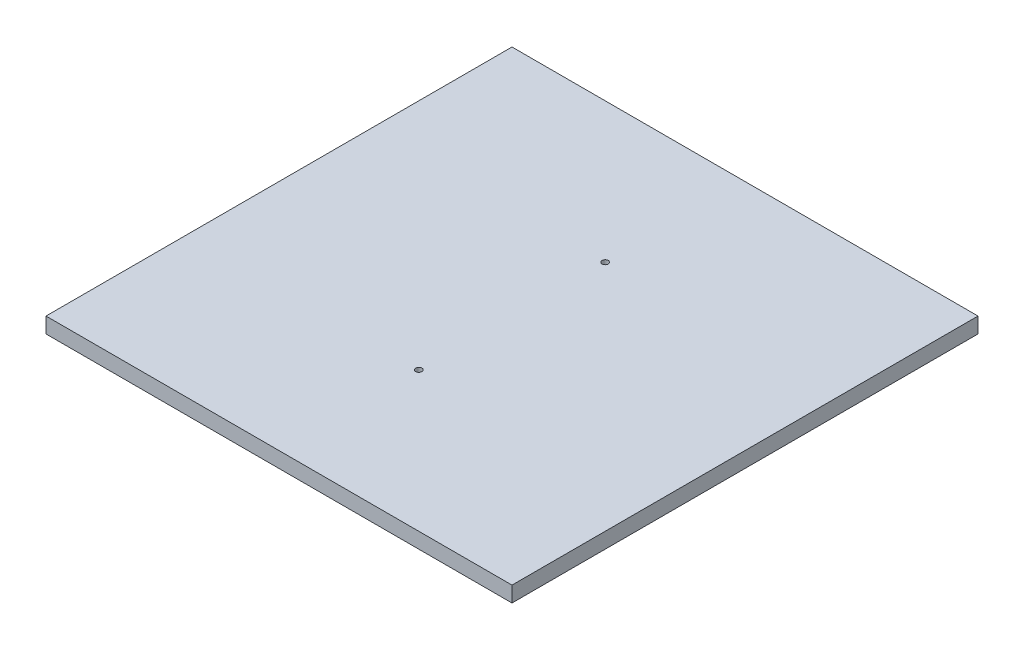
ISO-10303-21;
HEADER;
FILE_DESCRIPTION(('STEP AP214'),'2;1');
FILE_NAME('part.step','',(''),(''),'','','');
FILE_SCHEMA(('AUTOMOTIVE_DESIGN { 1 0 10303 214 1 1 1 1 }'));
ENDSEC;
DATA;
#1=APPLICATION_CONTEXT('core data for automotive mechanical design processes');
#2=APPLICATION_PROTOCOL_DEFINITION('international standard','automotive_design',2000,#1);
#3=PRODUCT_CONTEXT('',#1,'mechanical');
#4=PRODUCT('Part','Part','',(#3));
#5=PRODUCT_RELATED_PRODUCT_CATEGORY('part','',(#4));
#6=PRODUCT_DEFINITION_FORMATION('','',#4);
#7=PRODUCT_DEFINITION_CONTEXT('part definition',#1,'design');
#8=PRODUCT_DEFINITION('design','',#6,#7);
#9=PRODUCT_DEFINITION_SHAPE('','',#8);
#10=(LENGTH_UNIT() NAMED_UNIT(*) SI_UNIT(.MILLI.,.METRE.));
#11=(NAMED_UNIT(*) PLANE_ANGLE_UNIT() SI_UNIT($,.RADIAN.));
#12=(NAMED_UNIT(*) SI_UNIT($,.STERADIAN.) SOLID_ANGLE_UNIT());
#13=UNCERTAINTY_MEASURE_WITH_UNIT(LENGTH_MEASURE(1.E-05),#10,'distance_accuracy_value','');
#14=(GEOMETRIC_REPRESENTATION_CONTEXT(3) GLOBAL_UNCERTAINTY_ASSIGNED_CONTEXT((#13)) GLOBAL_UNIT_ASSIGNED_CONTEXT((#10,
#11,#12)) REPRESENTATION_CONTEXT('',''));
#15=CARTESIAN_POINT('',(0.,0.,0.));
#16=DIRECTION('',(0.,0.,1.));
#17=DIRECTION('',(1.,0.,0.));
#18=AXIS2_PLACEMENT_3D('',#15,#16,#17);
#19=CARTESIAN_POINT('',(0.,5.,0.));
#20=DIRECTION('',(0.,-1.,0.));
#21=DIRECTION('',(0.,0.,-1.));
#22=AXIS2_PLACEMENT_3D('',#19,#20,#21);
#23=PLANE('',#22);
#24=DIRECTION('',(0.,0.,-1.));
#25=VECTOR('',#24,1.);
#26=CARTESIAN_POINT('',(75.,5.,75.));
#27=LINE('',#26,#25);
#28=CARTESIAN_POINT('',(75.,5.,75.));
#29=VERTEX_POINT('',#28);
#30=CARTESIAN_POINT('',(75.,5.,-75.));
#31=VERTEX_POINT('',#30);
#32=EDGE_CURVE('E92',#29,#31,#27,.T.);
#33=ORIENTED_EDGE('',*,*,#32,.T.);
#34=DIRECTION('',(-1.,0.,0.));
#35=VECTOR('',#34,1.);
#36=CARTESIAN_POINT('',(-75.,5.,-75.));
#37=LINE('',#36,#35);
#38=CARTESIAN_POINT('',(-75.,5.,-75.));
#39=VERTEX_POINT('',#38);
#40=EDGE_CURVE('E87',#31,#39,#37,.T.);
#41=ORIENTED_EDGE('',*,*,#40,.T.);
#42=DIRECTION('',(0.,0.,1.));
#43=VECTOR('',#42,1.);
#44=CARTESIAN_POINT('',(-75.,5.,75.));
#45=LINE('',#44,#43);
#46=CARTESIAN_POINT('',(-75.,5.,75.));
#47=VERTEX_POINT('',#46);
#48=EDGE_CURVE('E90',#39,#47,#45,.T.);
#49=ORIENTED_EDGE('',*,*,#48,.T.);
#50=DIRECTION('',(1.,0.,0.));
#51=VECTOR('',#50,1.);
#52=CARTESIAN_POINT('',(-75.,5.,75.));
#53=LINE('',#52,#51);
#54=EDGE_CURVE('E57',#47,#29,#53,.T.);
#55=ORIENTED_EDGE('',*,*,#54,.T.);
#56=EDGE_LOOP('',(#33,#41,#49,#55));
#57=FACE_BOUND('',#56,.T.);
#58=CARTESIAN_POINT('',(0.,5.,-30.));
#59=DIRECTION('',(0.,1.,0.));
#60=DIRECTION('',(0.,0.,1.));
#61=AXIS2_PLACEMENT_3D('',#58,#59,#60);
#62=CIRCLE('',#61,1.);
#63=CARTESIAN_POINT('',(0.,5.,-29.));
#64=VERTEX_POINT('',#63);
#65=EDGE_CURVE('E112',#64,#64,#62,.T.);
#66=ORIENTED_EDGE('',*,*,#65,.F.);
#67=EDGE_LOOP('',(#66));
#68=FACE_BOUND('',#67,.T.);
#69=CARTESIAN_POINT('',(0.,5.,30.));
#70=DIRECTION('',(0.,1.,0.));
#71=DIRECTION('',(0.,0.,1.));
#72=AXIS2_PLACEMENT_3D('',#69,#70,#71);
#73=CIRCLE('',#72,1.);
#74=CARTESIAN_POINT('',(0.,5.,31.));
#75=VERTEX_POINT('',#74);
#76=EDGE_CURVE('E134',#75,#75,#73,.T.);
#77=ORIENTED_EDGE('',*,*,#76,.F.);
#78=EDGE_LOOP('',(#77));
#79=FACE_BOUND('',#78,.T.);
#80=ADVANCED_FACE('F39',(#57,#68,#79),#23,.F.);
#81=CARTESIAN_POINT('',(0.,0.,0.));
#82=DIRECTION('',(0.,-1.,0.));
#83=DIRECTION('',(0.,0.,-1.));
#84=AXIS2_PLACEMENT_3D('',#81,#82,#83);
#85=PLANE('',#84);
#86=CARTESIAN_POINT('',(0.,0.,-30.));
#87=DIRECTION('',(0.,1.,0.));
#88=DIRECTION('',(0.,0.,1.));
#89=AXIS2_PLACEMENT_3D('',#86,#87,#88);
#90=CIRCLE('',#89,1.);
#91=CARTESIAN_POINT('',(0.,0.,-29.));
#92=VERTEX_POINT('',#91);
#93=EDGE_CURVE('E130',#92,#92,#90,.T.);
#94=ORIENTED_EDGE('',*,*,#93,.T.);
#95=EDGE_LOOP('',(#94));
#96=FACE_BOUND('',#95,.T.);
#97=DIRECTION('',(0.,0.,-1.));
#98=VECTOR('',#97,1.);
#99=CARTESIAN_POINT('',(75.,0.,75.));
#100=LINE('',#99,#98);
#101=CARTESIAN_POINT('',(75.,0.,75.));
#102=VERTEX_POINT('',#101);
#103=CARTESIAN_POINT('',(75.,0.,-75.));
#104=VERTEX_POINT('',#103);
#105=EDGE_CURVE('E108',#102,#104,#100,.T.);
#106=ORIENTED_EDGE('',*,*,#105,.F.);
#107=DIRECTION('',(1.,0.,0.));
#108=VECTOR('',#107,1.);
#109=CARTESIAN_POINT('',(-75.,0.,75.));
#110=LINE('',#109,#108);
#111=CARTESIAN_POINT('',(-75.,0.,75.));
#112=VERTEX_POINT('',#111);
#113=EDGE_CURVE('E80',#112,#102,#110,.T.);
#114=ORIENTED_EDGE('',*,*,#113,.F.);
#115=DIRECTION('',(0.,0.,1.));
#116=VECTOR('',#115,1.);
#117=CARTESIAN_POINT('',(-75.,0.,75.));
#118=LINE('',#117,#116);
#119=CARTESIAN_POINT('',(-75.,0.,-75.));
#120=VERTEX_POINT('',#119);
#121=EDGE_CURVE('E74',#120,#112,#118,.T.);
#122=ORIENTED_EDGE('',*,*,#121,.F.);
#123=DIRECTION('',(-1.,0.,0.));
#124=VECTOR('',#123,1.);
#125=CARTESIAN_POINT('',(-75.,0.,-75.));
#126=LINE('',#125,#124);
#127=EDGE_CURVE('E97',#104,#120,#126,.T.);
#128=ORIENTED_EDGE('',*,*,#127,.F.);
#129=EDGE_LOOP('',(#106,#114,#122,#128));
#130=FACE_BOUND('',#129,.T.);
#131=CARTESIAN_POINT('',(0.,0.,30.));
#132=DIRECTION('',(0.,1.,0.));
#133=DIRECTION('',(0.,0.,1.));
#134=AXIS2_PLACEMENT_3D('',#131,#132,#133);
#135=CIRCLE('',#134,1.);
#136=CARTESIAN_POINT('',(0.,0.,31.));
#137=VERTEX_POINT('',#136);
#138=EDGE_CURVE('E138',#137,#137,#135,.T.);
#139=ORIENTED_EDGE('',*,*,#138,.T.);
#140=EDGE_LOOP('',(#139));
#141=FACE_BOUND('',#140,.T.);
#142=ADVANCED_FACE('F125',(#96,#130,#141),#85,.T.);
#143=CARTESIAN_POINT('',(75.,5.,75.));
#144=DIRECTION('',(-1.,0.,0.));
#145=DIRECTION('',(0.,0.,1.));
#146=AXIS2_PLACEMENT_3D('',#143,#144,#145);
#147=PLANE('',#146);
#148=ORIENTED_EDGE('',*,*,#105,.T.);
#149=DIRECTION('',(0.,-1.,0.));
#150=VECTOR('',#149,1.);
#151=CARTESIAN_POINT('',(75.,5.,-75.));
#152=LINE('',#151,#150);
#153=EDGE_CURVE('E11',#31,#104,#152,.T.);
#154=ORIENTED_EDGE('',*,*,#153,.F.);
#155=ORIENTED_EDGE('',*,*,#32,.F.);
#156=DIRECTION('',(0.,-1.,0.));
#157=VECTOR('',#156,1.);
#158=CARTESIAN_POINT('',(75.,5.,75.));
#159=LINE('',#158,#157);
#160=EDGE_CURVE('E104',#29,#102,#159,.T.);
#161=ORIENTED_EDGE('',*,*,#160,.T.);
#162=EDGE_LOOP('',(#148,#154,#155,#161));
#163=FACE_BOUND('',#162,.T.);
#164=ADVANCED_FACE('F41',(#163),#147,.F.);
#165=CARTESIAN_POINT('',(-75.,5.,-75.));
#166=DIRECTION('',(0.,0.,1.));
#167=DIRECTION('',(1.,0.,0.));
#168=AXIS2_PLACEMENT_3D('',#165,#166,#167);
#169=PLANE('',#168);
#170=ORIENTED_EDGE('',*,*,#127,.T.);
#171=DIRECTION('',(0.,-1.,0.));
#172=VECTOR('',#171,1.);
#173=CARTESIAN_POINT('',(-75.,5.,-75.));
#174=LINE('',#173,#172);
#175=EDGE_CURVE('E49',#39,#120,#174,.T.);
#176=ORIENTED_EDGE('',*,*,#175,.F.);
#177=ORIENTED_EDGE('',*,*,#40,.F.);
#178=ORIENTED_EDGE('',*,*,#153,.T.);
#179=EDGE_LOOP('',(#170,#176,#177,#178));
#180=FACE_BOUND('',#179,.T.);
#181=ADVANCED_FACE('F96',(#180),#169,.F.);
#182=CARTESIAN_POINT('',(-75.,5.,75.));
#183=DIRECTION('',(1.,0.,0.));
#184=DIRECTION('',(0.,0.,-1.));
#185=AXIS2_PLACEMENT_3D('',#182,#183,#184);
#186=PLANE('',#185);
#187=ORIENTED_EDGE('',*,*,#121,.T.);
#188=DIRECTION('',(0.,-1.,0.));
#189=VECTOR('',#188,1.);
#190=CARTESIAN_POINT('',(-75.,5.,75.));
#191=LINE('',#190,#189);
#192=EDGE_CURVE('E99',#47,#112,#191,.T.);
#193=ORIENTED_EDGE('',*,*,#192,.F.);
#194=ORIENTED_EDGE('',*,*,#48,.F.);
#195=ORIENTED_EDGE('',*,*,#175,.T.);
#196=EDGE_LOOP('',(#187,#193,#194,#195));
#197=FACE_BOUND('',#196,.T.);
#198=ADVANCED_FACE('F100',(#197),#186,.F.);
#199=CARTESIAN_POINT('',(-75.,5.,75.));
#200=DIRECTION('',(0.,0.,-1.));
#201=DIRECTION('',(-1.,0.,0.));
#202=AXIS2_PLACEMENT_3D('',#199,#200,#201);
#203=PLANE('',#202);
#204=ORIENTED_EDGE('',*,*,#113,.T.);
#205=ORIENTED_EDGE('',*,*,#160,.F.);
#206=ORIENTED_EDGE('',*,*,#54,.F.);
#207=ORIENTED_EDGE('',*,*,#192,.T.);
#208=EDGE_LOOP('',(#204,#205,#206,#207));
#209=FACE_BOUND('',#208,.T.);
#210=ADVANCED_FACE('F122',(#209),#203,.F.);
#211=CARTESIAN_POINT('',(0.,5.,-30.));
#212=DIRECTION('',(0.,-1.,0.));
#213=DIRECTION('',(0.,0.,-1.));
#214=AXIS2_PLACEMENT_3D('',#211,#212,#213);
#215=CYLINDRICAL_SURFACE('',#214,1.);
#216=ORIENTED_EDGE('',*,*,#65,.T.);
#217=EDGE_LOOP('',(#216));
#218=FACE_BOUND('',#217,.T.);
#219=ORIENTED_EDGE('',*,*,#93,.F.);
#220=EDGE_LOOP('',(#219));
#221=FACE_BOUND('',#220,.T.);
#222=ADVANCED_FACE('F157',(#218,#221),#215,.F.);
#223=CARTESIAN_POINT('',(0.,5.,30.));
#224=DIRECTION('',(0.,-1.,0.));
#225=DIRECTION('',(0.,0.,-1.));
#226=AXIS2_PLACEMENT_3D('',#223,#224,#225);
#227=CYLINDRICAL_SURFACE('',#226,1.);
#228=ORIENTED_EDGE('',*,*,#76,.T.);
#229=EDGE_LOOP('',(#228));
#230=FACE_BOUND('',#229,.T.);
#231=ORIENTED_EDGE('',*,*,#138,.F.);
#232=EDGE_LOOP('',(#231));
#233=FACE_BOUND('',#232,.T.);
#234=ADVANCED_FACE('F146',(#230,#233),#227,.F.);
#235=CLOSED_SHELL('',(#80,#142,#164,#181,#198,#210,#222,#234));
#236=MANIFOLD_SOLID_BREP('B2',#235);
#237=ADVANCED_BREP_SHAPE_REPRESENTATION('',(#18,#236),#14);
#238=SHAPE_DEFINITION_REPRESENTATION(#9,#237);
ENDSEC;
END-ISO-10303-21;
